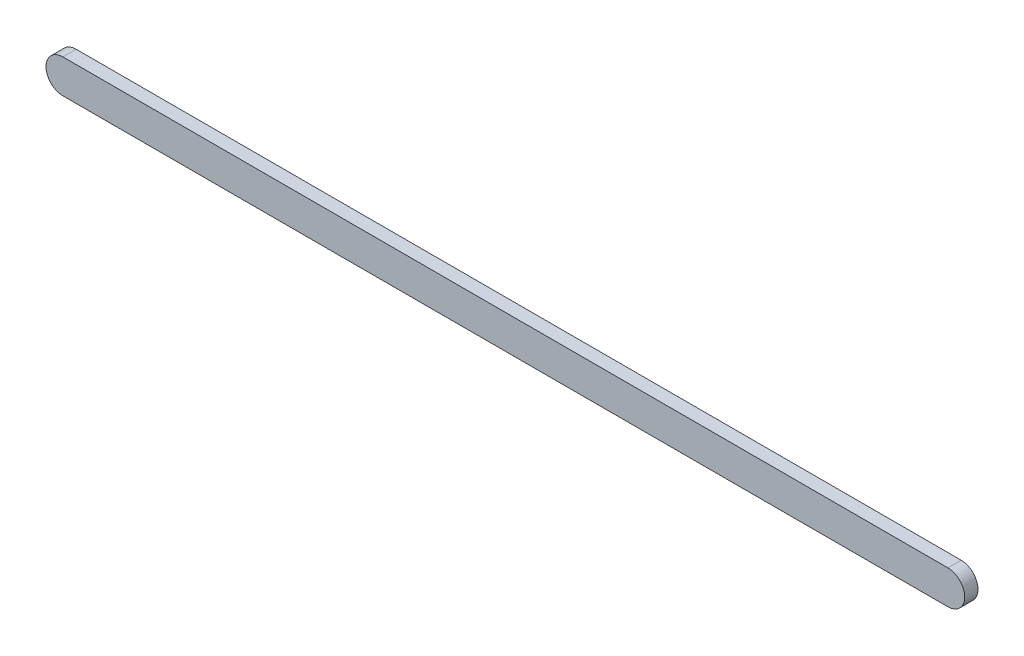
ISO-10303-21;
HEADER;
FILE_DESCRIPTION(('STEP AP214'),'2;1');
FILE_NAME('part.step','',(''),(''),'','','');
FILE_SCHEMA(('AUTOMOTIVE_DESIGN { 1 0 10303 214 1 1 1 1 }'));
ENDSEC;
DATA;
#1=APPLICATION_CONTEXT('core data for automotive mechanical design processes');
#2=APPLICATION_PROTOCOL_DEFINITION('international standard','automotive_design',2000,#1);
#3=PRODUCT_CONTEXT('',#1,'mechanical');
#4=PRODUCT('Part','Part','',(#3));
#5=PRODUCT_RELATED_PRODUCT_CATEGORY('part','',(#4));
#6=PRODUCT_DEFINITION_FORMATION('','',#4);
#7=PRODUCT_DEFINITION_CONTEXT('part definition',#1,'design');
#8=PRODUCT_DEFINITION('design','',#6,#7);
#9=PRODUCT_DEFINITION_SHAPE('','',#8);
#10=(LENGTH_UNIT() NAMED_UNIT(*) SI_UNIT(.MILLI.,.METRE.));
#11=(NAMED_UNIT(*) PLANE_ANGLE_UNIT() SI_UNIT($,.RADIAN.));
#12=(NAMED_UNIT(*) SI_UNIT($,.STERADIAN.) SOLID_ANGLE_UNIT());
#13=UNCERTAINTY_MEASURE_WITH_UNIT(LENGTH_MEASURE(1.E-05),#10,'distance_accuracy_value','');
#14=(GEOMETRIC_REPRESENTATION_CONTEXT(3) GLOBAL_UNCERTAINTY_ASSIGNED_CONTEXT((#13)) GLOBAL_UNIT_ASSIGNED_CONTEXT((#10,
#11,#12)) REPRESENTATION_CONTEXT('',''));
#15=CARTESIAN_POINT('',(0.,0.,0.));
#16=DIRECTION('',(0.,0.,1.));
#17=DIRECTION('',(1.,0.,0.));
#18=AXIS2_PLACEMENT_3D('',#15,#16,#17);
#19=CARTESIAN_POINT('',(139.065,121.92,0.));
#20=DIRECTION('',(0.,1.,0.));
#21=DIRECTION('',(1.,0.,0.));
#22=AXIS2_PLACEMENT_3D('',#19,#20,#21);
#23=PLANE('',#22);
#24=DIRECTION('',(1.,0.,0.));
#25=VECTOR('',#24,1.);
#26=CARTESIAN_POINT('',(139.065,121.92,0.1999996));
#27=LINE('',#26,#25);
#28=CARTESIAN_POINT('',(139.065,121.92,0.1999996));
#29=VERTEX_POINT('',#28);
#30=CARTESIAN_POINT('',(152.4,121.92,0.1999996));
#31=VERTEX_POINT('',#30);
#32=EDGE_CURVE('E11',#29,#31,#27,.T.);
#33=ORIENTED_EDGE('',*,*,#32,.F.);
#34=DIRECTION('',(0.,0.,1.));
#35=VECTOR('',#34,1.);
#36=CARTESIAN_POINT('',(139.065,121.92,0.));
#37=LINE('',#36,#35);
#38=CARTESIAN_POINT('',(139.065,121.92,0.));
#39=VERTEX_POINT('',#38);
#40=EDGE_CURVE('E24',#39,#29,#37,.T.);
#41=ORIENTED_EDGE('',*,*,#40,.F.);
#42=DIRECTION('',(1.,0.,0.));
#43=VECTOR('',#42,1.);
#44=CARTESIAN_POINT('',(139.065,121.92,0.));
#45=LINE('',#44,#43);
#46=CARTESIAN_POINT('',(152.4,121.92,0.));
#47=VERTEX_POINT('',#46);
#48=EDGE_CURVE('E75',#39,#47,#45,.T.);
#49=ORIENTED_EDGE('',*,*,#48,.T.);
#50=DIRECTION('',(0.,0.,1.));
#51=VECTOR('',#50,1.);
#52=CARTESIAN_POINT('',(152.4,121.92,0.));
#53=LINE('',#52,#51);
#54=EDGE_CURVE('E37',#47,#31,#53,.T.);
#55=ORIENTED_EDGE('',*,*,#54,.T.);
#56=EDGE_LOOP('',(#33,#41,#49,#55));
#57=FACE_BOUND('',#56,.T.);
#58=ADVANCED_FACE('F17',(#57),#23,.F.);
#59=CARTESIAN_POINT('',(152.4,122.174,0.));
#60=DIRECTION('',(0.,0.,-1.));
#61=DIRECTION('',(1.11896493820492E-13,-1.,0.));
#62=AXIS2_PLACEMENT_3D('',#59,#60,#61);
#63=CYLINDRICAL_SURFACE('',#62,0.254000000000005);
#64=CARTESIAN_POINT('',(152.4,122.174,0.1999996));
#65=DIRECTION('',(0.,0.,1.));
#66=DIRECTION('',(1.11896493820492E-13,-1.,0.));
#67=AXIS2_PLACEMENT_3D('',#64,#65,#66);
#68=CIRCLE('',#67,0.254000000000005);
#69=CARTESIAN_POINT('',(152.4,122.428,0.1999996));
#70=VERTEX_POINT('',#69);
#71=EDGE_CURVE('E83',#31,#70,#68,.T.);
#72=ORIENTED_EDGE('',*,*,#71,.F.);
#73=ORIENTED_EDGE('',*,*,#54,.F.);
#74=CARTESIAN_POINT('',(152.4,122.174,0.));
#75=DIRECTION('',(0.,0.,1.));
#76=DIRECTION('',(1.11896493820492E-13,-1.,0.));
#77=AXIS2_PLACEMENT_3D('',#74,#75,#76);
#78=CIRCLE('',#77,0.254000000000005);
#79=CARTESIAN_POINT('',(152.4,122.428,0.));
#80=VERTEX_POINT('',#79);
#81=EDGE_CURVE('E81',#47,#80,#78,.T.);
#82=ORIENTED_EDGE('',*,*,#81,.T.);
#83=DIRECTION('',(0.,0.,1.));
#84=VECTOR('',#83,1.);
#85=CARTESIAN_POINT('',(152.4,122.428,0.));
#86=LINE('',#85,#84);
#87=EDGE_CURVE('E67',#80,#70,#86,.T.);
#88=ORIENTED_EDGE('',*,*,#87,.T.);
#89=EDGE_LOOP('',(#72,#73,#82,#88));
#90=FACE_BOUND('',#89,.T.);
#91=ADVANCED_FACE('F89',(#90),#63,.T.);
#92=CARTESIAN_POINT('',(152.4,122.428,0.));
#93=DIRECTION('',(0.,-1.,0.));
#94=DIRECTION('',(-1.,0.,0.));
#95=AXIS2_PLACEMENT_3D('',#92,#93,#94);
#96=PLANE('',#95);
#97=DIRECTION('',(-1.,0.,0.));
#98=VECTOR('',#97,1.);
#99=CARTESIAN_POINT('',(152.4,122.428,0.1999996));
#100=LINE('',#99,#98);
#101=CARTESIAN_POINT('',(139.065,122.428,0.1999996));
#102=VERTEX_POINT('',#101);
#103=EDGE_CURVE('E71',#70,#102,#100,.T.);
#104=ORIENTED_EDGE('',*,*,#103,.F.);
#105=ORIENTED_EDGE('',*,*,#87,.F.);
#106=DIRECTION('',(-1.,0.,0.));
#107=VECTOR('',#106,1.);
#108=CARTESIAN_POINT('',(152.4,122.428,0.));
#109=LINE('',#108,#107);
#110=CARTESIAN_POINT('',(139.065,122.428,0.));
#111=VERTEX_POINT('',#110);
#112=EDGE_CURVE('E63',#80,#111,#109,.T.);
#113=ORIENTED_EDGE('',*,*,#112,.T.);
#114=DIRECTION('',(0.,0.,1.));
#115=VECTOR('',#114,1.);
#116=CARTESIAN_POINT('',(139.065,122.428,0.));
#117=LINE('',#116,#115);
#118=EDGE_CURVE('E53',#111,#102,#117,.T.);
#119=ORIENTED_EDGE('',*,*,#118,.T.);
#120=EDGE_LOOP('',(#104,#105,#113,#119));
#121=FACE_BOUND('',#120,.T.);
#122=ADVANCED_FACE('F66',(#121),#96,.F.);
#123=CARTESIAN_POINT('',(139.065,122.174,0.));
#124=DIRECTION('',(0.,0.,-1.));
#125=DIRECTION('',(0.,1.,0.));
#126=AXIS2_PLACEMENT_3D('',#123,#124,#125);
#127=CYLINDRICAL_SURFACE('',#126,0.253999999999995);
#128=CARTESIAN_POINT('',(139.065,122.174,0.1999996));
#129=DIRECTION('',(0.,0.,1.));
#130=DIRECTION('',(0.,1.,0.));
#131=AXIS2_PLACEMENT_3D('',#128,#129,#130);
#132=CIRCLE('',#131,0.253999999999995);
#133=EDGE_CURVE('E59',#102,#29,#132,.T.);
#134=ORIENTED_EDGE('',*,*,#133,.F.);
#135=ORIENTED_EDGE('',*,*,#118,.F.);
#136=CARTESIAN_POINT('',(139.065,122.174,0.));
#137=DIRECTION('',(0.,0.,1.));
#138=DIRECTION('',(0.,1.,0.));
#139=AXIS2_PLACEMENT_3D('',#136,#137,#138);
#140=CIRCLE('',#139,0.253999999999995);
#141=EDGE_CURVE('E57',#111,#39,#140,.T.);
#142=ORIENTED_EDGE('',*,*,#141,.T.);
#143=ORIENTED_EDGE('',*,*,#40,.T.);
#144=EDGE_LOOP('',(#134,#135,#142,#143));
#145=FACE_BOUND('',#144,.T.);
#146=ADVANCED_FACE('F55',(#145),#127,.T.);
#147=CARTESIAN_POINT('',(139.065,121.92,0.));
#148=DIRECTION('',(0.,0.,-1.));
#149=DIRECTION('',(-1.,0.,0.));
#150=AXIS2_PLACEMENT_3D('',#147,#148,#149);
#151=PLANE('',#150);
#152=ORIENTED_EDGE('',*,*,#141,.F.);
#153=ORIENTED_EDGE('',*,*,#112,.F.);
#154=ORIENTED_EDGE('',*,*,#81,.F.);
#155=ORIENTED_EDGE('',*,*,#48,.F.);
#156=EDGE_LOOP('',(#152,#153,#154,#155));
#157=FACE_BOUND('',#156,.T.);
#158=ADVANCED_FACE('F74',(#157),#151,.T.);
#159=CARTESIAN_POINT('',(139.065,121.92,0.1999996));
#160=DIRECTION('',(0.,0.,-1.));
#161=DIRECTION('',(-1.,0.,0.));
#162=AXIS2_PLACEMENT_3D('',#159,#160,#161);
#163=PLANE('',#162);
#164=ORIENTED_EDGE('',*,*,#32,.T.);
#165=ORIENTED_EDGE('',*,*,#71,.T.);
#166=ORIENTED_EDGE('',*,*,#103,.T.);
#167=ORIENTED_EDGE('',*,*,#133,.T.);
#168=EDGE_LOOP('',(#164,#165,#166,#167));
#169=FACE_BOUND('',#168,.T.);
#170=ADVANCED_FACE('F91',(#169),#163,.F.);
#171=CLOSED_SHELL('',(#58,#91,#122,#146,#158,#170));
#172=MANIFOLD_SOLID_BREP('B1',#171);
#173=ADVANCED_BREP_SHAPE_REPRESENTATION('',(#18,#172),#14);
#174=SHAPE_DEFINITION_REPRESENTATION(#9,#173);
ENDSEC;
END-ISO-10303-21;
